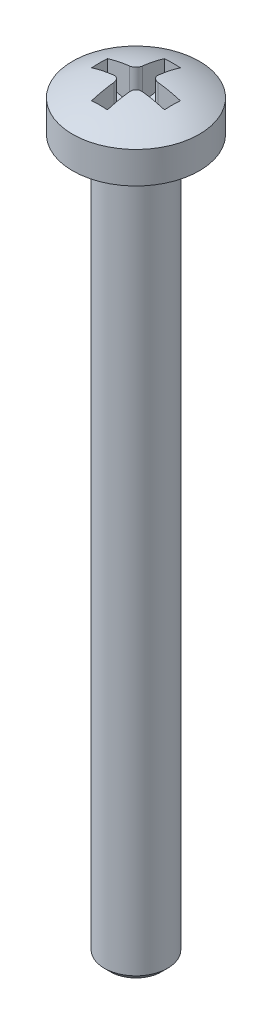
ISO-10303-21;
HEADER;
FILE_DESCRIPTION(('STEP AP214'),'2;1');
FILE_NAME('part.step','',(''),(''),'','','');
FILE_SCHEMA(('AUTOMOTIVE_DESIGN { 1 0 10303 214 1 1 1 1 }'));
ENDSEC;
DATA;
#1=APPLICATION_CONTEXT('core data for automotive mechanical design processes');
#2=APPLICATION_PROTOCOL_DEFINITION('international standard','automotive_design',2000,#1);
#3=PRODUCT_CONTEXT('',#1,'mechanical');
#4=PRODUCT('Part','Part','',(#3));
#5=PRODUCT_RELATED_PRODUCT_CATEGORY('part','',(#4));
#6=PRODUCT_DEFINITION_FORMATION('','',#4);
#7=PRODUCT_DEFINITION_CONTEXT('part definition',#1,'design');
#8=PRODUCT_DEFINITION('design','',#6,#7);
#9=PRODUCT_DEFINITION_SHAPE('','',#8);
#10=(LENGTH_UNIT() NAMED_UNIT(*) SI_UNIT(.MILLI.,.METRE.));
#11=(NAMED_UNIT(*) PLANE_ANGLE_UNIT() SI_UNIT($,.RADIAN.));
#12=(NAMED_UNIT(*) SI_UNIT($,.STERADIAN.) SOLID_ANGLE_UNIT());
#13=UNCERTAINTY_MEASURE_WITH_UNIT(LENGTH_MEASURE(1.E-05),#10,'distance_accuracy_value','');
#14=(GEOMETRIC_REPRESENTATION_CONTEXT(3) GLOBAL_UNCERTAINTY_ASSIGNED_CONTEXT((#13)) GLOBAL_UNIT_ASSIGNED_CONTEXT((#10,
#11,#12)) REPRESENTATION_CONTEXT('',''));
#15=CARTESIAN_POINT('',(0.,0.,0.));
#16=DIRECTION('',(0.,0.,1.));
#17=DIRECTION('',(1.,0.,0.));
#18=AXIS2_PLACEMENT_3D('',#15,#16,#17);
#19=CARTESIAN_POINT('',(2.00000000000001,-45.,0.));
#20=DIRECTION('',(0.,1.,0.));
#21=DIRECTION('',(0.,0.,1.));
#22=AXIS2_PLACEMENT_3D('',#19,#20,#21);
#23=PLANE('',#22);
#24=CARTESIAN_POINT('',(0.,-45.,0.));
#25=DIRECTION('',(0.,1.,0.));
#26=DIRECTION('',(0.,0.,1.));
#27=AXIS2_PLACEMENT_3D('',#24,#25,#26);
#28=CIRCLE('',#27,1.6);
#29=CARTESIAN_POINT('',(0.,-45.,1.6));
#30=VERTEX_POINT('',#29);
#31=EDGE_CURVE('E11',#30,#30,#28,.F.);
#32=ORIENTED_EDGE('',*,*,#31,.T.);
#33=EDGE_LOOP('',(#32));
#34=FACE_BOUND('',#33,.T.);
#35=ADVANCED_FACE('F37',(#34),#23,.F.);
#36=CARTESIAN_POINT('',(0.,-4.72272727272728,0.));
#37=DIRECTION('',(0.,1.,0.));
#38=DIRECTION('',(1.,0.,0.));
#39=AXIS2_PLACEMENT_3D('',#36,#37,#38);
#40=SPHERICAL_SURFACE('',#39,7.82272727272728);
#41=CARTESIAN_POINT('',(0.5,-4.72272727272728,0.));
#42=DIRECTION('',(1.,0.,0.));
#43=DIRECTION('',(0.,0.,-1.));
#44=AXIS2_PLACEMENT_3D('',#41,#42,#43);
#45=CIRCLE('',#44,7.80673183755348);
#46=CARTESIAN_POINT('',(0.5,2.73750476008987,-2.3));
#47=VERTEX_POINT('',#46);
#48=CARTESIAN_POINT('',(0.5,3.03195273249996,-0.9));
#49=VERTEX_POINT('',#48);
#50=EDGE_CURVE('E195',#47,#49,#45,.T.);
#51=ORIENTED_EDGE('',*,*,#50,.T.);
#52=CARTESIAN_POINT('',(0.5,3.03195273249996,-0.9));
#53=CARTESIAN_POINT('',(0.499980445653111,3.03454133641409,-0.877715199489853));
#54=CARTESIAN_POINT('',(0.501861325410847,3.0369109081898,-0.855406290685576));
#55=CARTESIAN_POINT('',(0.509308944557218,3.04115309750786,-0.811373363194762));
#56=CARTESIAN_POINT('',(0.514874142284133,3.04302592244948,-0.789649103823202));
#57=CARTESIAN_POINT('',(0.529581237998282,3.04621922226135,-0.747382590966706));
#58=CARTESIAN_POINT('',(0.538725894104163,3.0475392695665,-0.726841263013532));
#59=CARTESIAN_POINT('',(0.560335395409864,3.04958563422558,-0.687561895208892));
#60=CARTESIAN_POINT('',(0.572799188800053,3.05031213937239,-0.668823286645484));
#61=CARTESIAN_POINT('',(0.600596407799792,3.05114682561896,-0.633816736919395));
#62=CARTESIAN_POINT('',(0.615908512897499,3.05125942358876,-0.617531968951503));
#63=CARTESIAN_POINT('',(0.649026593510928,3.0508747494218,-0.587736528915892));
#64=CARTESIAN_POINT('',(0.666832948845617,3.05037738431157,-0.57422628012003));
#65=CARTESIAN_POINT('',(0.704363578386314,3.04879030089852,-0.550401537052683));
#66=CARTESIAN_POINT('',(0.724081674108829,3.04770244181268,-0.540077170971166));
#67=CARTESIAN_POINT('',(0.764919862434989,3.04496752601447,-0.522847557382613));
#68=CARTESIAN_POINT('',(0.786039420133905,3.04332068167708,-0.515941013789886));
#69=CARTESIAN_POINT('',(0.822714805755103,3.04007942212771,-0.5072274099574));
#70=CARTESIAN_POINT('',(0.838074093965798,3.03861284502167,-0.504517057384848));
#71=CARTESIAN_POINT('',(0.868957976534767,3.0354499847468,-0.500903202638105));
#72=CARTESIAN_POINT('',(0.88448230264661,3.03375403356009,-0.499997118337815));
#73=CARTESIAN_POINT('',(0.9,3.03195273249996,-0.5));
#74=B_SPLINE_CURVE_WITH_KNOTS('',3,(#52,#53,#54,#55,#56,#57,#58,#59,#60,#61,#62,#63,#64,#65,#66,
#67,#68,#69,#70,#71,#72,#73),.UNSPECIFIED.,.F.,.F.,(4,2,2,2,2,2,2,2,2,2,4),(0.,
0.0672224170043276,0.134416723302517,0.201662907801201,0.26888780779591,0.335628401088124,
0.402379168562592,0.468920974876219,0.535437528240593,0.582332561709017,0.629160434341086),.UNSPECIFIED.);
#75=CARTESIAN_POINT('',(0.9,3.03195273249996,-0.5));
#76=VERTEX_POINT('',#75);
#77=EDGE_CURVE('E257',#49,#76,#74,.T.);
#78=ORIENTED_EDGE('',*,*,#77,.T.);
#79=CARTESIAN_POINT('',(0.,-4.72272727272728,-0.5));
#80=DIRECTION('',(0.,0.,-1.));
#81=DIRECTION('',(-1.,0.,0.));
#82=AXIS2_PLACEMENT_3D('',#79,#80,#81);
#83=CIRCLE('',#82,7.80673183755348);
#84=CARTESIAN_POINT('',(2.3,2.73750476008987,-0.5));
#85=VERTEX_POINT('',#84);
#86=EDGE_CURVE('E193',#76,#85,#83,.T.);
#87=ORIENTED_EDGE('',*,*,#86,.T.);
#88=CARTESIAN_POINT('',(2.3,-4.72272727272728,0.));
#89=DIRECTION('',(1.,0.,0.));
#90=DIRECTION('',(0.,0.,-1.));
#91=AXIS2_PLACEMENT_3D('',#88,#89,#90);
#92=CIRCLE('',#91,7.47696876972688);
#93=CARTESIAN_POINT('',(2.3,2.73750476008987,0.5));
#94=VERTEX_POINT('',#93);
#95=EDGE_CURVE('E170',#85,#94,#92,.T.);
#96=ORIENTED_EDGE('',*,*,#95,.T.);
#97=CARTESIAN_POINT('',(0.,-4.72272727272728,0.5));
#98=DIRECTION('',(0.,0.,1.));
#99=DIRECTION('',(1.,0.,0.));
#100=AXIS2_PLACEMENT_3D('',#97,#98,#99);
#101=CIRCLE('',#100,7.80673183755348);
#102=CARTESIAN_POINT('',(0.9,3.03195273249996,0.5));
#103=VERTEX_POINT('',#102);
#104=EDGE_CURVE('E219',#94,#103,#101,.T.);
#105=ORIENTED_EDGE('',*,*,#104,.T.);
#106=CARTESIAN_POINT('',(0.9,3.03195273249996,0.5));
#107=CARTESIAN_POINT('',(0.877715199489853,3.03454133641409,0.499980445653111));
#108=CARTESIAN_POINT('',(0.855406290685576,3.0369109081898,0.501861325410847));
#109=CARTESIAN_POINT('',(0.811373363194762,3.04115309750786,0.509308944557218));
#110=CARTESIAN_POINT('',(0.789649103823202,3.04302592244948,0.514874142284133));
#111=CARTESIAN_POINT('',(0.747382590966706,3.04621922226135,0.529581237998282));
#112=CARTESIAN_POINT('',(0.726841263013532,3.0475392695665,0.538725894104163));
#113=CARTESIAN_POINT('',(0.687561895208891,3.04958563422558,0.560335395409864));
#114=CARTESIAN_POINT('',(0.668823286645484,3.05031213937239,0.572799188800053));
#115=CARTESIAN_POINT('',(0.633816736919395,3.05114682561896,0.600596407799792));
#116=CARTESIAN_POINT('',(0.617531968951503,3.05125942358877,0.6159085128975));
#117=CARTESIAN_POINT('',(0.587736528915892,3.0508747494218,0.649026593510929));
#118=CARTESIAN_POINT('',(0.57422628012003,3.05037738431157,0.666832948845617));
#119=CARTESIAN_POINT('',(0.550401537052683,3.04879030089852,0.704363578386314));
#120=CARTESIAN_POINT('',(0.540077170971166,3.04770244181268,0.724081674108829));
#121=CARTESIAN_POINT('',(0.522847557382613,3.04496752601447,0.764919862434989));
#122=CARTESIAN_POINT('',(0.515941013789886,3.04332068167708,0.786039420133905));
#123=CARTESIAN_POINT('',(0.5072274099574,3.04007942212771,0.822714805755103));
#124=CARTESIAN_POINT('',(0.504517057384848,3.03861284502167,0.838074093965798));
#125=CARTESIAN_POINT('',(0.500903202638105,3.03544998474679,0.868957976534767));
#126=CARTESIAN_POINT('',(0.499997118337815,3.03375403356009,0.884482302646609));
#127=CARTESIAN_POINT('',(0.5,3.03195273249996,0.9));
#128=B_SPLINE_CURVE_WITH_KNOTS('',3,(#106,#107,#108,#109,#110,#111,#112,#113,#114,#115,#116,
#117,#118,#119,#120,#121,#122,#123,#124,#125,#126,#127),.UNSPECIFIED.,.F.,.F.,(4,2,2,2,2,2,2,2,
2,2,4),(0.,0.0672224170043276,0.134416723302517,0.201662907801201,0.268887807795911,
0.335628401088124,0.402379168562592,0.468920974876219,0.535437528240593,0.582332561709017,
0.629160434341086),.UNSPECIFIED.);
#129=CARTESIAN_POINT('',(0.5,3.03195273249996,0.9));
#130=VERTEX_POINT('',#129);
#131=EDGE_CURVE('E252',#103,#130,#128,.T.);
#132=ORIENTED_EDGE('',*,*,#131,.T.);
#133=CARTESIAN_POINT('',(0.5,-4.72272727272728,0.));
#134=DIRECTION('',(1.,0.,0.));
#135=DIRECTION('',(0.,0.,-1.));
#136=AXIS2_PLACEMENT_3D('',#133,#134,#135);
#137=CIRCLE('',#136,7.80673183755348);
#138=CARTESIAN_POINT('',(0.5,2.73750476008987,2.3));
#139=VERTEX_POINT('',#138);
#140=EDGE_CURVE('E217',#130,#139,#137,.T.);
#141=ORIENTED_EDGE('',*,*,#140,.T.);
#142=CARTESIAN_POINT('',(0.,-4.72272727272728,2.3));
#143=DIRECTION('',(0.,0.,1.));
#144=DIRECTION('',(1.,0.,0.));
#145=AXIS2_PLACEMENT_3D('',#142,#143,#144);
#146=CIRCLE('',#145,7.47696876972688);
#147=CARTESIAN_POINT('',(-0.5,2.73750476008987,2.3));
#148=VERTEX_POINT('',#147);
#149=EDGE_CURVE('E214',#139,#148,#146,.T.);
#150=ORIENTED_EDGE('',*,*,#149,.T.);
#151=CARTESIAN_POINT('',(-0.5,-4.72272727272728,0.));
#152=DIRECTION('',(-1.,0.,0.));
#153=DIRECTION('',(0.,0.,1.));
#154=AXIS2_PLACEMENT_3D('',#151,#152,#153);
#155=CIRCLE('',#154,7.80673183755348);
#156=CARTESIAN_POINT('',(-0.5,3.03195273249996,0.9));
#157=VERTEX_POINT('',#156);
#158=EDGE_CURVE('E211',#148,#157,#155,.T.);
#159=ORIENTED_EDGE('',*,*,#158,.T.);
#160=CARTESIAN_POINT('',(-0.5,3.03195273249996,0.9));
#161=CARTESIAN_POINT('',(-0.499980445653111,3.03454133641409,0.877715199489853));
#162=CARTESIAN_POINT('',(-0.501861325410847,3.0369109081898,0.855406290685576));
#163=CARTESIAN_POINT('',(-0.509308944557218,3.04115309750786,0.811373363194762));
#164=CARTESIAN_POINT('',(-0.514874142284133,3.04302592244948,0.789649103823202));
#165=CARTESIAN_POINT('',(-0.529581237998282,3.04621922226135,0.747382590966706));
#166=CARTESIAN_POINT('',(-0.538725894104163,3.0475392695665,0.726841263013532));
#167=CARTESIAN_POINT('',(-0.560335395409864,3.04958563422558,0.687561895208892));
#168=CARTESIAN_POINT('',(-0.572799188800053,3.05031213937239,0.668823286645484));
#169=CARTESIAN_POINT('',(-0.600596407799792,3.05114682561896,0.633816736919395));
#170=CARTESIAN_POINT('',(-0.6159085128975,3.05125942358876,0.617531968951503));
#171=CARTESIAN_POINT('',(-0.649026593510929,3.0508747494218,0.587736528915892));
#172=CARTESIAN_POINT('',(-0.666832948845617,3.05037738431157,0.57422628012003));
#173=CARTESIAN_POINT('',(-0.704363578386314,3.04879030089852,0.550401537052683));
#174=CARTESIAN_POINT('',(-0.724081674108829,3.04770244181268,0.540077170971166));
#175=CARTESIAN_POINT('',(-0.764919862434989,3.04496752601447,0.522847557382613));
#176=CARTESIAN_POINT('',(-0.786039420133905,3.04332068167708,0.515941013789887));
#177=CARTESIAN_POINT('',(-0.822714805755103,3.04007942212771,0.5072274099574));
#178=CARTESIAN_POINT('',(-0.838074093965798,3.03861284502167,0.504517057384848));
#179=CARTESIAN_POINT('',(-0.868957976534767,3.0354499847468,0.500903202638105));
#180=CARTESIAN_POINT('',(-0.88448230264661,3.03375403356009,0.499997118337815));
#181=CARTESIAN_POINT('',(-0.9,3.03195273249996,0.5));
#182=B_SPLINE_CURVE_WITH_KNOTS('',3,(#160,#161,#162,#163,#164,#165,#166,#167,#168,#169,#170,
#171,#172,#173,#174,#175,#176,#177,#178,#179,#180,#181),.UNSPECIFIED.,.F.,.F.,(4,2,2,2,2,2,2,2,
2,2,4),(0.,0.0672224170043276,0.134416723302517,0.201662907801201,0.26888780779591,
0.335628401088124,0.402379168562592,0.468920974876219,0.535437528240592,0.582332561709017,
0.629160434341086),.UNSPECIFIED.);
#183=CARTESIAN_POINT('',(-0.9,3.03195273249996,0.5));
#184=VERTEX_POINT('',#183);
#185=EDGE_CURVE('E231',#157,#184,#182,.T.);
#186=ORIENTED_EDGE('',*,*,#185,.T.);
#187=CARTESIAN_POINT('',(0.,-4.72272727272728,0.5));
#188=DIRECTION('',(0.,0.,1.));
#189=DIRECTION('',(1.,0.,0.));
#190=AXIS2_PLACEMENT_3D('',#187,#188,#189);
#191=CIRCLE('',#190,7.80673183755348);
#192=CARTESIAN_POINT('',(-2.3,2.73750476008987,0.5));
#193=VERTEX_POINT('',#192);
#194=EDGE_CURVE('E209',#184,#193,#191,.T.);
#195=ORIENTED_EDGE('',*,*,#194,.T.);
#196=CARTESIAN_POINT('',(-2.3,-4.72272727272728,0.));
#197=DIRECTION('',(-1.,0.,0.));
#198=DIRECTION('',(0.,0.,1.));
#199=AXIS2_PLACEMENT_3D('',#196,#197,#198);
#200=CIRCLE('',#199,7.47696876972688);
#201=CARTESIAN_POINT('',(-2.3,2.73750476008987,-0.5));
#202=VERTEX_POINT('',#201);
#203=EDGE_CURVE('E206',#193,#202,#200,.T.);
#204=ORIENTED_EDGE('',*,*,#203,.T.);
#205=CARTESIAN_POINT('',(0.,-4.72272727272728,-0.5));
#206=DIRECTION('',(0.,0.,-1.));
#207=DIRECTION('',(-1.,0.,0.));
#208=AXIS2_PLACEMENT_3D('',#205,#206,#207);
#209=CIRCLE('',#208,7.80673183755348);
#210=CARTESIAN_POINT('',(-0.9,3.03195273249996,-0.5));
#211=VERTEX_POINT('',#210);
#212=EDGE_CURVE('E203',#202,#211,#209,.T.);
#213=ORIENTED_EDGE('',*,*,#212,.T.);
#214=CARTESIAN_POINT('',(-0.9,3.03195273249996,-0.5));
#215=CARTESIAN_POINT('',(-0.877715199489853,3.03454133641409,-0.499980445653111));
#216=CARTESIAN_POINT('',(-0.855406290685576,3.0369109081898,-0.501861325410847));
#217=CARTESIAN_POINT('',(-0.811373363194762,3.04115309750786,-0.509308944557218));
#218=CARTESIAN_POINT('',(-0.789649103823202,3.04302592244948,-0.514874142284133));
#219=CARTESIAN_POINT('',(-0.747382590966706,3.04621922226135,-0.529581237998282));
#220=CARTESIAN_POINT('',(-0.726841263013532,3.0475392695665,-0.538725894104163));
#221=CARTESIAN_POINT('',(-0.687561895208892,3.04958563422558,-0.560335395409864));
#222=CARTESIAN_POINT('',(-0.668823286645484,3.05031213937239,-0.572799188800053));
#223=CARTESIAN_POINT('',(-0.633816736919395,3.05114682561896,-0.600596407799792));
#224=CARTESIAN_POINT('',(-0.617531968951503,3.05125942358877,-0.6159085128975));
#225=CARTESIAN_POINT('',(-0.587736528915892,3.0508747494218,-0.649026593510929));
#226=CARTESIAN_POINT('',(-0.57422628012003,3.05037738431157,-0.666832948845617));
#227=CARTESIAN_POINT('',(-0.550401537052683,3.04879030089852,-0.704363578386314));
#228=CARTESIAN_POINT('',(-0.540077170971166,3.04770244181268,-0.724081674108829));
#229=CARTESIAN_POINT('',(-0.522847557382613,3.04496752601447,-0.764919862434989));
#230=CARTESIAN_POINT('',(-0.515941013789887,3.04332068167708,-0.786039420133905));
#231=CARTESIAN_POINT('',(-0.5072274099574,3.04007942212771,-0.822714805755103));
#232=CARTESIAN_POINT('',(-0.504517057384848,3.03861284502167,-0.838074093965798));
#233=CARTESIAN_POINT('',(-0.500903202638105,3.03544998474679,-0.868957976534767));
#234=CARTESIAN_POINT('',(-0.499997118337815,3.03375403356009,-0.88448230264661));
#235=CARTESIAN_POINT('',(-0.5,3.03195273249996,-0.9));
#236=B_SPLINE_CURVE_WITH_KNOTS('',3,(#214,#215,#216,#217,#218,#219,#220,#221,#222,#223,#224,
#225,#226,#227,#228,#229,#230,#231,#232,#233,#234,#235),.UNSPECIFIED.,.F.,.F.,(4,2,2,2,2,2,2,2,
2,2,4),(0.,0.0672224170043276,0.134416723302517,0.201662907801201,0.268887807795911,
0.335628401088124,0.402379168562592,0.468920974876219,0.535437528240593,0.582332561709018,
0.629160434341086),.UNSPECIFIED.);
#237=CARTESIAN_POINT('',(-0.5,3.03195273249996,-0.9));
#238=VERTEX_POINT('',#237);
#239=EDGE_CURVE('E225',#211,#238,#236,.T.);
#240=ORIENTED_EDGE('',*,*,#239,.T.);
#241=CARTESIAN_POINT('',(-0.5,-4.72272727272728,0.));
#242=DIRECTION('',(-1.,0.,0.));
#243=DIRECTION('',(0.,0.,1.));
#244=AXIS2_PLACEMENT_3D('',#241,#242,#243);
#245=CIRCLE('',#244,7.80673183755348);
#246=CARTESIAN_POINT('',(-0.5,2.73750476008987,-2.3));
#247=VERTEX_POINT('',#246);
#248=EDGE_CURVE('E201',#238,#247,#245,.T.);
#249=ORIENTED_EDGE('',*,*,#248,.T.);
#250=CARTESIAN_POINT('',(0.,-4.72272727272728,-2.3));
#251=DIRECTION('',(0.,0.,-1.));
#252=DIRECTION('',(-1.,0.,0.));
#253=AXIS2_PLACEMENT_3D('',#250,#251,#252);
#254=CIRCLE('',#253,7.47696876972688);
#255=EDGE_CURVE('E198',#247,#47,#254,.T.);
#256=ORIENTED_EDGE('',*,*,#255,.T.);
#257=EDGE_LOOP('',(#51,#78,#87,#96,#105,#132,#141,#150,#159,#186,#195,#204,#213,#240,#249,#256));
#258=FACE_BOUND('',#257,.T.);
#259=CARTESIAN_POINT('',(0.,2.,0.));
#260=DIRECTION('',(0.,1.,0.));
#261=DIRECTION('',(0.,0.,1.));
#262=AXIS2_PLACEMENT_3D('',#259,#260,#261);
#263=CIRCLE('',#262,4.);
#264=CARTESIAN_POINT('',(0.,2.,4.));
#265=VERTEX_POINT('',#264);
#266=EDGE_CURVE('E189',#265,#265,#263,.T.);
#267=ORIENTED_EDGE('',*,*,#266,.T.);
#268=EDGE_LOOP('',(#267));
#269=FACE_BOUND('',#268,.T.);
#270=ADVANCED_FACE('F239',(#258,#269),#40,.T.);
#271=CARTESIAN_POINT('',(0.,3.1,0.));
#272=DIRECTION('',(0.,1.,0.));
#273=DIRECTION('',(0.,0.,1.));
#274=AXIS2_PLACEMENT_3D('',#271,#272,#273);
#275=CYLINDRICAL_SURFACE('',#274,4.);
#276=ORIENTED_EDGE('',*,*,#266,.F.);
#277=EDGE_LOOP('',(#276));
#278=FACE_BOUND('',#277,.T.);
#279=CARTESIAN_POINT('',(0.,0.,0.));
#280=DIRECTION('',(0.,1.,0.));
#281=DIRECTION('',(0.,0.,1.));
#282=AXIS2_PLACEMENT_3D('',#279,#280,#281);
#283=CIRCLE('',#282,4.);
#284=CARTESIAN_POINT('',(0.,0.,4.));
#285=VERTEX_POINT('',#284);
#286=EDGE_CURVE('E181',#285,#285,#283,.T.);
#287=ORIENTED_EDGE('',*,*,#286,.T.);
#288=EDGE_LOOP('',(#287));
#289=FACE_BOUND('',#288,.T.);
#290=ADVANCED_FACE('F244',(#278,#289),#275,.T.);
#291=CARTESIAN_POINT('',(4.,0.,0.));
#292=DIRECTION('',(0.,1.,0.));
#293=DIRECTION('',(0.,0.,1.));
#294=AXIS2_PLACEMENT_3D('',#291,#292,#293);
#295=PLANE('',#294);
#296=ORIENTED_EDGE('',*,*,#286,.F.);
#297=EDGE_LOOP('',(#296));
#298=FACE_BOUND('',#297,.T.);
#299=CARTESIAN_POINT('',(0.,0.,0.));
#300=DIRECTION('',(0.,1.,0.));
#301=DIRECTION('',(0.,0.,1.));
#302=AXIS2_PLACEMENT_3D('',#299,#300,#301);
#303=CIRCLE('',#302,2.);
#304=CARTESIAN_POINT('',(0.,0.,2.));
#305=VERTEX_POINT('',#304);
#306=EDGE_CURVE('E178',#305,#305,#303,.T.);
#307=ORIENTED_EDGE('',*,*,#306,.T.);
#308=EDGE_LOOP('',(#307));
#309=FACE_BOUND('',#308,.T.);
#310=ADVANCED_FACE('F331',(#298,#309),#295,.F.);
#311=CARTESIAN_POINT('',(0.,3.1,0.));
#312=DIRECTION('',(0.,1.,0.));
#313=DIRECTION('',(0.,0.,1.));
#314=AXIS2_PLACEMENT_3D('',#311,#312,#313);
#315=CYLINDRICAL_SURFACE('',#314,2.);
#316=CARTESIAN_POINT('',(0.,-44.6,0.));
#317=DIRECTION('',(0.,1.,0.));
#318=DIRECTION('',(0.,0.,1.));
#319=AXIS2_PLACEMENT_3D('',#316,#317,#318);
#320=CIRCLE('',#319,2.);
#321=CARTESIAN_POINT('',(0.,-44.6,2.));
#322=VERTEX_POINT('',#321);
#323=EDGE_CURVE('E45',#322,#322,#320,.T.);
#324=ORIENTED_EDGE('',*,*,#323,.T.);
#325=EDGE_LOOP('',(#324));
#326=FACE_BOUND('',#325,.T.);
#327=ORIENTED_EDGE('',*,*,#306,.F.);
#328=EDGE_LOOP('',(#327));
#329=FACE_BOUND('',#328,.T.);
#330=ADVANCED_FACE('F303',(#326,#329),#315,.T.);
#331=CARTESIAN_POINT('',(0.5,-45.001,0.5));
#332=DIRECTION('',(0.,0.,1.));
#333=DIRECTION('',(1.,0.,0.));
#334=AXIS2_PLACEMENT_3D('',#331,#332,#333);
#335=PLANE('',#334);
#336=CARTESIAN_POINT('',(0.,9.49999999999998,0.5));
#337=DIRECTION('',(0.,0.,1.));
#338=DIRECTION('',(1.,0.,0.));
#339=AXIS2_PLACEMENT_3D('',#336,#337,#338);
#340=CIRCLE('',#339,8.48528137423855);
#341=CARTESIAN_POINT('',(2.3,1.3323810079069,0.5));
#342=VERTEX_POINT('',#341);
#343=CARTESIAN_POINT('',(0.9,1.06258333374486,0.5));
#344=VERTEX_POINT('',#343);
#345=EDGE_CURVE('E176',#342,#344,#340,.F.);
#346=ORIENTED_EDGE('',*,*,#345,.T.);
#347=DIRECTION('',(0.,1.,0.));
#348=VECTOR('',#347,1.);
#349=CARTESIAN_POINT('',(0.9,-45.001,0.5));
#350=LINE('',#349,#348);
#351=EDGE_CURVE('E556',#344,#103,#350,.T.);
#352=ORIENTED_EDGE('',*,*,#351,.T.);
#353=ORIENTED_EDGE('',*,*,#104,.F.);
#354=DIRECTION('',(0.,1.,0.));
#355=VECTOR('',#354,1.);
#356=CARTESIAN_POINT('',(2.3,-45.001,0.5));
#357=LINE('',#356,#355);
#358=EDGE_CURVE('E172',#342,#94,#357,.T.);
#359=ORIENTED_EDGE('',*,*,#358,.F.);
#360=EDGE_LOOP('',(#346,#352,#353,#359));
#361=FACE_BOUND('',#360,.T.);
#362=ADVANCED_FACE('F344',(#361),#335,.F.);
#363=CARTESIAN_POINT('',(0.5,-45.001,0.5));
#364=DIRECTION('',(1.,0.,0.));
#365=DIRECTION('',(0.,0.,-1.));
#366=AXIS2_PLACEMENT_3D('',#363,#364,#365);
#367=PLANE('',#366);
#368=ORIENTED_EDGE('',*,*,#140,.F.);
#369=DIRECTION('',(0.,1.,0.));
#370=VECTOR('',#369,1.);
#371=CARTESIAN_POINT('',(0.5,-45.001,0.9));
#372=LINE('',#371,#370);
#373=CARTESIAN_POINT('',(0.5,1.06258333374486,0.9));
#374=VERTEX_POINT('',#373);
#375=EDGE_CURVE('E554',#130,#374,#372,.F.);
#376=ORIENTED_EDGE('',*,*,#375,.T.);
#377=CARTESIAN_POINT('',(0.5,9.49999999999998,0.));
#378=DIRECTION('',(1.,0.,0.));
#379=DIRECTION('',(0.,0.,-1.));
#380=AXIS2_PLACEMENT_3D('',#377,#378,#379);
#381=CIRCLE('',#380,8.48528137423855);
#382=CARTESIAN_POINT('',(0.5,1.3323810079069,2.3));
#383=VERTEX_POINT('',#382);
#384=EDGE_CURVE('E183',#374,#383,#381,.F.);
#385=ORIENTED_EDGE('',*,*,#384,.T.);
#386=DIRECTION('',(0.,1.,0.));
#387=VECTOR('',#386,1.);
#388=CARTESIAN_POINT('',(0.5,-45.001,2.3));
#389=LINE('',#388,#387);
#390=EDGE_CURVE('E162',#383,#139,#389,.T.);
#391=ORIENTED_EDGE('',*,*,#390,.T.);
#392=EDGE_LOOP('',(#368,#376,#385,#391));
#393=FACE_BOUND('',#392,.T.);
#394=ADVANCED_FACE('F292',(#393),#367,.F.);
#395=CARTESIAN_POINT('',(-0.5,-45.001,2.3));
#396=DIRECTION('',(0.,0.,1.));
#397=DIRECTION('',(1.,0.,0.));
#398=AXIS2_PLACEMENT_3D('',#395,#396,#397);
#399=PLANE('',#398);
#400=ORIENTED_EDGE('',*,*,#390,.F.);
#401=CARTESIAN_POINT('',(0.,9.49999999999998,2.3));
#402=DIRECTION('',(0.,0.,1.));
#403=DIRECTION('',(1.,0.,0.));
#404=AXIS2_PLACEMENT_3D('',#401,#402,#403);
#405=CIRCLE('',#404,8.18290901819149);
#406=CARTESIAN_POINT('',(-0.5,1.3323810079069,2.3));
#407=VERTEX_POINT('',#406);
#408=EDGE_CURVE('E518',#383,#407,#405,.F.);
#409=ORIENTED_EDGE('',*,*,#408,.T.);
#410=DIRECTION('',(0.,1.,0.));
#411=VECTOR('',#410,1.);
#412=CARTESIAN_POINT('',(-0.5,-45.001,2.3));
#413=LINE('',#412,#411);
#414=EDGE_CURVE('E517',#407,#148,#413,.T.);
#415=ORIENTED_EDGE('',*,*,#414,.T.);
#416=ORIENTED_EDGE('',*,*,#149,.F.);
#417=EDGE_LOOP('',(#400,#409,#415,#416));
#418=FACE_BOUND('',#417,.T.);
#419=ADVANCED_FACE('F357',(#418),#399,.F.);
#420=CARTESIAN_POINT('',(-0.5,-45.001,0.5));
#421=DIRECTION('',(-1.,0.,0.));
#422=DIRECTION('',(0.,0.,1.));
#423=AXIS2_PLACEMENT_3D('',#420,#421,#422);
#424=PLANE('',#423);
#425=CARTESIAN_POINT('',(-0.5,9.49999999999998,0.));
#426=DIRECTION('',(-1.,0.,0.));
#427=DIRECTION('',(0.,0.,1.));
#428=AXIS2_PLACEMENT_3D('',#425,#426,#427);
#429=CIRCLE('',#428,8.48528137423855);
#430=CARTESIAN_POINT('',(-0.5,1.06258333374486,0.9));
#431=VERTEX_POINT('',#430);
#432=EDGE_CURVE('E512',#407,#431,#429,.F.);
#433=ORIENTED_EDGE('',*,*,#432,.T.);
#434=DIRECTION('',(0.,1.,0.));
#435=VECTOR('',#434,1.);
#436=CARTESIAN_POINT('',(-0.5,-45.001,0.9));
#437=LINE('',#436,#435);
#438=EDGE_CURVE('E507',#431,#157,#437,.T.);
#439=ORIENTED_EDGE('',*,*,#438,.T.);
#440=ORIENTED_EDGE('',*,*,#158,.F.);
#441=ORIENTED_EDGE('',*,*,#414,.F.);
#442=EDGE_LOOP('',(#433,#439,#440,#441));
#443=FACE_BOUND('',#442,.T.);
#444=ADVANCED_FACE('F364',(#443),#424,.F.);
#445=CARTESIAN_POINT('',(-2.3,-45.001,0.5));
#446=DIRECTION('',(0.,0.,1.));
#447=DIRECTION('',(1.,0.,0.));
#448=AXIS2_PLACEMENT_3D('',#445,#446,#447);
#449=PLANE('',#448);
#450=ORIENTED_EDGE('',*,*,#194,.F.);
#451=DIRECTION('',(0.,1.,0.));
#452=VECTOR('',#451,1.);
#453=CARTESIAN_POINT('',(-0.9,-45.001,0.5));
#454=LINE('',#453,#452);
#455=CARTESIAN_POINT('',(-0.9,1.06258333374486,0.5));
#456=VERTEX_POINT('',#455);
#457=EDGE_CURVE('E505',#184,#456,#454,.F.);
#458=ORIENTED_EDGE('',*,*,#457,.T.);
#459=CARTESIAN_POINT('',(0.,9.49999999999998,0.5));
#460=DIRECTION('',(0.,0.,1.));
#461=DIRECTION('',(1.,0.,0.));
#462=AXIS2_PLACEMENT_3D('',#459,#460,#461);
#463=CIRCLE('',#462,8.48528137423855);
#464=CARTESIAN_POINT('',(-2.3,1.3323810079069,0.5));
#465=VERTEX_POINT('',#464);
#466=EDGE_CURVE('E515',#456,#465,#463,.F.);
#467=ORIENTED_EDGE('',*,*,#466,.T.);
#468=DIRECTION('',(0.,1.,0.));
#469=VECTOR('',#468,1.);
#470=CARTESIAN_POINT('',(-2.3,-45.001,0.5));
#471=LINE('',#470,#469);
#472=EDGE_CURVE('E529',#465,#193,#471,.T.);
#473=ORIENTED_EDGE('',*,*,#472,.T.);
#474=EDGE_LOOP('',(#450,#458,#467,#473));
#475=FACE_BOUND('',#474,.T.);
#476=ADVANCED_FACE('F371',(#475),#449,.F.);
#477=CARTESIAN_POINT('',(-2.3,-45.001,-0.5));
#478=DIRECTION('',(-1.,0.,0.));
#479=DIRECTION('',(0.,0.,1.));
#480=AXIS2_PLACEMENT_3D('',#477,#478,#479);
#481=PLANE('',#480);
#482=ORIENTED_EDGE('',*,*,#472,.F.);
#483=CARTESIAN_POINT('',(-2.3,9.49999999999998,0.));
#484=DIRECTION('',(-1.,0.,0.));
#485=DIRECTION('',(0.,0.,1.));
#486=AXIS2_PLACEMENT_3D('',#483,#484,#485);
#487=CIRCLE('',#486,8.18290901819149);
#488=CARTESIAN_POINT('',(-2.3,1.3323810079069,-0.5));
#489=VERTEX_POINT('',#488);
#490=EDGE_CURVE('E521',#465,#489,#487,.F.);
#491=ORIENTED_EDGE('',*,*,#490,.T.);
#492=DIRECTION('',(0.,1.,0.));
#493=VECTOR('',#492,1.);
#494=CARTESIAN_POINT('',(-2.3,-45.001,-0.5));
#495=LINE('',#494,#493);
#496=EDGE_CURVE('E532',#489,#202,#495,.T.);
#497=ORIENTED_EDGE('',*,*,#496,.T.);
#498=ORIENTED_EDGE('',*,*,#203,.F.);
#499=EDGE_LOOP('',(#482,#491,#497,#498));
#500=FACE_BOUND('',#499,.T.);
#501=ADVANCED_FACE('F379',(#500),#481,.F.);
#502=CARTESIAN_POINT('',(-2.3,-45.001,-0.5));
#503=DIRECTION('',(0.,0.,-1.));
#504=DIRECTION('',(-1.,0.,0.));
#505=AXIS2_PLACEMENT_3D('',#502,#503,#504);
#506=PLANE('',#505);
#507=CARTESIAN_POINT('',(0.,9.49999999999998,-0.5));
#508=DIRECTION('',(0.,0.,-1.));
#509=DIRECTION('',(-1.,0.,0.));
#510=AXIS2_PLACEMENT_3D('',#507,#508,#509);
#511=CIRCLE('',#510,8.48528137423855);
#512=CARTESIAN_POINT('',(-0.9,1.06258333374486,-0.5));
#513=VERTEX_POINT('',#512);
#514=EDGE_CURVE('E564',#489,#513,#511,.F.);
#515=ORIENTED_EDGE('',*,*,#514,.T.);
#516=DIRECTION('',(0.,1.,0.));
#517=VECTOR('',#516,1.);
#518=CARTESIAN_POINT('',(-0.9,-45.001,-0.5));
#519=LINE('',#518,#517);
#520=EDGE_CURVE('E549',#513,#211,#519,.T.);
#521=ORIENTED_EDGE('',*,*,#520,.T.);
#522=ORIENTED_EDGE('',*,*,#212,.F.);
#523=ORIENTED_EDGE('',*,*,#496,.F.);
#524=EDGE_LOOP('',(#515,#521,#522,#523));
#525=FACE_BOUND('',#524,.T.);
#526=ADVANCED_FACE('F387',(#525),#506,.F.);
#527=CARTESIAN_POINT('',(-0.5,-45.001,-2.3));
#528=DIRECTION('',(-1.,0.,0.));
#529=DIRECTION('',(0.,0.,1.));
#530=AXIS2_PLACEMENT_3D('',#527,#528,#529);
#531=PLANE('',#530);
#532=ORIENTED_EDGE('',*,*,#248,.F.);
#533=DIRECTION('',(0.,1.,0.));
#534=VECTOR('',#533,1.);
#535=CARTESIAN_POINT('',(-0.5,-45.001,-0.9));
#536=LINE('',#535,#534);
#537=CARTESIAN_POINT('',(-0.5,1.06258333374486,-0.9));
#538=VERTEX_POINT('',#537);
#539=EDGE_CURVE('E52',#238,#538,#536,.F.);
#540=ORIENTED_EDGE('',*,*,#539,.T.);
#541=CARTESIAN_POINT('',(-0.5,9.49999999999998,0.));
#542=DIRECTION('',(-1.,0.,0.));
#543=DIRECTION('',(0.,0.,1.));
#544=AXIS2_PLACEMENT_3D('',#541,#542,#543);
#545=CIRCLE('',#544,8.48528137423855);
#546=CARTESIAN_POINT('',(-0.5,1.3323810079069,-2.3));
#547=VERTEX_POINT('',#546);
#548=EDGE_CURVE('E560',#538,#547,#545,.F.);
#549=ORIENTED_EDGE('',*,*,#548,.T.);
#550=DIRECTION('',(0.,1.,0.));
#551=VECTOR('',#550,1.);
#552=CARTESIAN_POINT('',(-0.5,-45.001,-2.3));
#553=LINE('',#552,#551);
#554=EDGE_CURVE('E535',#547,#247,#553,.T.);
#555=ORIENTED_EDGE('',*,*,#554,.T.);
#556=EDGE_LOOP('',(#532,#540,#549,#555));
#557=FACE_BOUND('',#556,.T.);
#558=ADVANCED_FACE('F395',(#557),#531,.F.);
#559=CARTESIAN_POINT('',(-0.5,-45.001,-2.3));
#560=DIRECTION('',(0.,0.,-1.));
#561=DIRECTION('',(-1.,0.,0.));
#562=AXIS2_PLACEMENT_3D('',#559,#560,#561);
#563=PLANE('',#562);
#564=ORIENTED_EDGE('',*,*,#554,.F.);
#565=CARTESIAN_POINT('',(0.,9.49999999999998,-2.3));
#566=DIRECTION('',(0.,0.,-1.));
#567=DIRECTION('',(-1.,0.,0.));
#568=AXIS2_PLACEMENT_3D('',#565,#566,#567);
#569=CIRCLE('',#568,8.18290901819149);
#570=CARTESIAN_POINT('',(0.5,1.3323810079069,-2.3));
#571=VERTEX_POINT('',#570);
#572=EDGE_CURVE('E543',#547,#571,#569,.F.);
#573=ORIENTED_EDGE('',*,*,#572,.T.);
#574=DIRECTION('',(0.,1.,0.));
#575=VECTOR('',#574,1.);
#576=CARTESIAN_POINT('',(0.5,-45.001,-2.3));
#577=LINE('',#576,#575);
#578=EDGE_CURVE('E171',#571,#47,#577,.T.);
#579=ORIENTED_EDGE('',*,*,#578,.T.);
#580=ORIENTED_EDGE('',*,*,#255,.F.);
#581=EDGE_LOOP('',(#564,#573,#579,#580));
#582=FACE_BOUND('',#581,.T.);
#583=ADVANCED_FACE('F403',(#582),#563,.F.);
#584=CARTESIAN_POINT('',(0.5,-45.001,-2.3));
#585=DIRECTION('',(1.,0.,0.));
#586=DIRECTION('',(0.,0.,-1.));
#587=AXIS2_PLACEMENT_3D('',#584,#585,#586);
#588=PLANE('',#587);
#589=CARTESIAN_POINT('',(0.5,9.49999999999998,0.));
#590=DIRECTION('',(1.,0.,0.));
#591=DIRECTION('',(0.,0.,-1.));
#592=AXIS2_PLACEMENT_3D('',#589,#590,#591);
#593=CIRCLE('',#592,8.48528137423855);
#594=CARTESIAN_POINT('',(0.5,1.06258333374486,-0.9));
#595=VERTEX_POINT('',#594);
#596=EDGE_CURVE('E161',#571,#595,#593,.F.);
#597=ORIENTED_EDGE('',*,*,#596,.T.);
#598=DIRECTION('',(0.,1.,0.));
#599=VECTOR('',#598,1.);
#600=CARTESIAN_POINT('',(0.5,-45.001,-0.9));
#601=LINE('',#600,#599);
#602=EDGE_CURVE('E222',#595,#49,#601,.T.);
#603=ORIENTED_EDGE('',*,*,#602,.T.);
#604=ORIENTED_EDGE('',*,*,#50,.F.);
#605=ORIENTED_EDGE('',*,*,#578,.F.);
#606=EDGE_LOOP('',(#597,#603,#604,#605));
#607=FACE_BOUND('',#606,.T.);
#608=ADVANCED_FACE('F410',(#607),#588,.F.);
#609=CARTESIAN_POINT('',(0.5,-45.001,-0.5));
#610=DIRECTION('',(0.,0.,-1.));
#611=DIRECTION('',(-1.,0.,0.));
#612=AXIS2_PLACEMENT_3D('',#609,#610,#611);
#613=PLANE('',#612);
#614=ORIENTED_EDGE('',*,*,#86,.F.);
#615=DIRECTION('',(0.,1.,0.));
#616=VECTOR('',#615,1.);
#617=CARTESIAN_POINT('',(0.9,-45.001,-0.5));
#618=LINE('',#617,#616);
#619=CARTESIAN_POINT('',(0.9,1.06258333374486,-0.5));
#620=VERTEX_POINT('',#619);
#621=EDGE_CURVE('E158',#76,#620,#618,.F.);
#622=ORIENTED_EDGE('',*,*,#621,.T.);
#623=CARTESIAN_POINT('',(0.,9.49999999999998,-0.5));
#624=DIRECTION('',(0.,0.,-1.));
#625=DIRECTION('',(-1.,0.,0.));
#626=AXIS2_PLACEMENT_3D('',#623,#624,#625);
#627=CIRCLE('',#626,8.48528137423855);
#628=CARTESIAN_POINT('',(2.3,1.3323810079069,-0.5));
#629=VERTEX_POINT('',#628);
#630=EDGE_CURVE('E152',#620,#629,#627,.F.);
#631=ORIENTED_EDGE('',*,*,#630,.T.);
#632=DIRECTION('',(0.,1.,0.));
#633=VECTOR('',#632,1.);
#634=CARTESIAN_POINT('',(2.3,-45.001,-0.5));
#635=LINE('',#634,#633);
#636=EDGE_CURVE('E156',#629,#85,#635,.T.);
#637=ORIENTED_EDGE('',*,*,#636,.T.);
#638=EDGE_LOOP('',(#614,#622,#631,#637));
#639=FACE_BOUND('',#638,.T.);
#640=ADVANCED_FACE('F155',(#639),#613,.F.);
#641=CARTESIAN_POINT('',(2.3,-45.001,-0.5));
#642=DIRECTION('',(1.,0.,0.));
#643=DIRECTION('',(0.,0.,-1.));
#644=AXIS2_PLACEMENT_3D('',#641,#642,#643);
#645=PLANE('',#644);
#646=ORIENTED_EDGE('',*,*,#636,.F.);
#647=CARTESIAN_POINT('',(2.3,9.49999999999998,0.));
#648=DIRECTION('',(1.,0.,0.));
#649=DIRECTION('',(0.,0.,-1.));
#650=AXIS2_PLACEMENT_3D('',#647,#648,#649);
#651=CIRCLE('',#650,8.18290901819149);
#652=EDGE_CURVE('E167',#629,#342,#651,.F.);
#653=ORIENTED_EDGE('',*,*,#652,.T.);
#654=ORIENTED_EDGE('',*,*,#358,.T.);
#655=ORIENTED_EDGE('',*,*,#95,.F.);
#656=EDGE_LOOP('',(#646,#653,#654,#655));
#657=FACE_BOUND('',#656,.T.);
#658=ADVANCED_FACE('F166',(#657),#645,.F.);
#659=CARTESIAN_POINT('',(0.,9.49999999999998,0.));
#660=DIRECTION('',(0.,1.,0.));
#661=DIRECTION('',(1.,0.,0.));
#662=AXIS2_PLACEMENT_3D('',#659,#660,#661);
#663=SPHERICAL_SURFACE('',#662,8.49999999999998);
#664=ORIENTED_EDGE('',*,*,#345,.F.);
#665=ORIENTED_EDGE('',*,*,#652,.F.);
#666=ORIENTED_EDGE('',*,*,#630,.F.);
#667=CARTESIAN_POINT('',(0.9,1.06258333374486,-0.5));
#668=CARTESIAN_POINT('',(0.877681895176581,1.06020064583187,-0.499980506377996));
#669=CARTESIAN_POINT('',(0.855344205727362,1.0580201488652,-0.501866869905914));
#670=CARTESIAN_POINT('',(0.811264196369215,1.05411756501269,-0.509332340473144));
#671=CARTESIAN_POINT('',(0.78952159882242,1.05239526097159,-0.514909693823375));
#672=CARTESIAN_POINT('',(0.747228556255667,1.04945966047884,-0.529643735623788));
#673=CARTESIAN_POINT('',(0.726678990033897,1.04824673524169,-0.538803025087882));
#674=CARTESIAN_POINT('',(0.687389852539137,1.04636746374655,-0.560442280349619));
#675=CARTESIAN_POINT('',(0.668649749482246,1.04570095646757,-0.572921266446781));
#676=CARTESIAN_POINT('',(0.633625729643449,1.04493649451643,-0.600763861630353));
#677=CARTESIAN_POINT('',(0.617327507926939,1.04483509156346,-0.616109383561911));
#678=CARTESIAN_POINT('',(0.587514637710959,1.04519463942213,-0.649299998886555));
#679=CARTESIAN_POINT('',(0.574000432084661,1.04565567962496,-0.667145489209941));
#680=CARTESIAN_POINT('',(0.55017165377276,1.04712438551599,-0.704769667803527));
#681=CARTESIAN_POINT('',(0.539848822620757,1.04813062146146,-0.724543189195622));
#682=CARTESIAN_POINT('',(0.522637980126425,1.05065941614313,-0.765498290560969));
#683=CARTESIAN_POINT('',(0.515748559609182,1.05218176262027,-0.78667928881133));
#684=CARTESIAN_POINT('',(0.507116958212197,1.05516459963325,-0.823303350164225));
#685=CARTESIAN_POINT('',(0.504448298653858,1.05650461680506,-0.838544928463922));
#686=CARTESIAN_POINT('',(0.500889732891837,1.05939256924764,-0.869192646434852));
#687=CARTESIAN_POINT('',(0.499997287547255,1.06094020433808,-0.884598519500552));
#688=CARTESIAN_POINT('',(0.5,1.06258333374486,-0.9));
#689=B_SPLINE_CURVE_WITH_KNOTS('',3,(#667,#668,#669,#670,#671,#672,#673,#674,#675,#676,#677,
#678,#679,#680,#681,#682,#683,#684,#685,#686,#687,#688),.UNSPECIFIED.,.F.,.F.,(4,2,2,2,2,2,2,2,
2,2,4),(0.,0.0672520458092346,0.134472161271656,0.201741179358209,0.268990367163335,
0.33582874565086,0.402677748396607,0.469352286257207,0.535999436300152,0.582495090258099,
0.628924229684279),.UNSPECIFIED.);
#690=EDGE_CURVE('E280',#620,#595,#689,.T.);
#691=ORIENTED_EDGE('',*,*,#690,.T.);
#692=ORIENTED_EDGE('',*,*,#596,.F.);
#693=ORIENTED_EDGE('',*,*,#572,.F.);
#694=ORIENTED_EDGE('',*,*,#548,.F.);
#695=CARTESIAN_POINT('',(-0.5,1.06258333374486,-0.9));
#696=CARTESIAN_POINT('',(-0.499980506377996,1.06020064583187,-0.877681895176581));
#697=CARTESIAN_POINT('',(-0.501866869905914,1.0580201488652,-0.855344205727362));
#698=CARTESIAN_POINT('',(-0.509332340473144,1.05411756501269,-0.811264196369215));
#699=CARTESIAN_POINT('',(-0.514909693823375,1.05239526097159,-0.789521598822421));
#700=CARTESIAN_POINT('',(-0.529643735623788,1.04945966047884,-0.747228556255667));
#701=CARTESIAN_POINT('',(-0.538803025087882,1.04824673524169,-0.726678990033897));
#702=CARTESIAN_POINT('',(-0.56044228034962,1.04636746374655,-0.687389852539137));
#703=CARTESIAN_POINT('',(-0.572921266446781,1.04570095646757,-0.668649749482246));
#704=CARTESIAN_POINT('',(-0.600763861630353,1.04493649451643,-0.633625729643449));
#705=CARTESIAN_POINT('',(-0.616109383561911,1.04483509156346,-0.617327507926939));
#706=CARTESIAN_POINT('',(-0.649299998886555,1.04519463942213,-0.58751463771096));
#707=CARTESIAN_POINT('',(-0.667145489209941,1.04565567962496,-0.574000432084661));
#708=CARTESIAN_POINT('',(-0.704769667803527,1.04712438551599,-0.550171653772761));
#709=CARTESIAN_POINT('',(-0.724543189195622,1.04813062146146,-0.539848822620758));
#710=CARTESIAN_POINT('',(-0.765498290560969,1.05065941614313,-0.522637980126425));
#711=CARTESIAN_POINT('',(-0.78667928881133,1.05218176262027,-0.515748559609182));
#712=CARTESIAN_POINT('',(-0.823303350164225,1.05516459963325,-0.507116958212197));
#713=CARTESIAN_POINT('',(-0.838544928463922,1.05650461680506,-0.504448298653858));
#714=CARTESIAN_POINT('',(-0.869192646434852,1.05939256924764,-0.500889732891837));
#715=CARTESIAN_POINT('',(-0.884598519500552,1.06094020433808,-0.499997287547255));
#716=CARTESIAN_POINT('',(-0.9,1.06258333374486,-0.5));
#717=B_SPLINE_CURVE_WITH_KNOTS('',3,(#695,#696,#697,#698,#699,#700,#701,#702,#703,#704,#705,
#706,#707,#708,#709,#710,#711,#712,#713,#714,#715,#716),.UNSPECIFIED.,.F.,.F.,(4,2,2,2,2,2,2,2,
2,2,4),(0.,0.0672520458092345,0.134472161271656,0.201741179358209,0.268990367163335,
0.33582874565086,0.402677748396607,0.469352286257207,0.535999436300152,0.582495090258099,
0.628924229684279),.UNSPECIFIED.);
#718=EDGE_CURVE('E59',#538,#513,#717,.T.);
#719=ORIENTED_EDGE('',*,*,#718,.T.);
#720=ORIENTED_EDGE('',*,*,#514,.F.);
#721=ORIENTED_EDGE('',*,*,#490,.F.);
#722=ORIENTED_EDGE('',*,*,#466,.F.);
#723=CARTESIAN_POINT('',(-0.9,1.06258333374486,0.5));
#724=CARTESIAN_POINT('',(-0.877681895176581,1.06020064583187,0.499980506377996));
#725=CARTESIAN_POINT('',(-0.855344205727362,1.0580201488652,0.501866869905914));
#726=CARTESIAN_POINT('',(-0.811264196369215,1.05411756501269,0.509332340473144));
#727=CARTESIAN_POINT('',(-0.789521598822421,1.05239526097159,0.514909693823375));
#728=CARTESIAN_POINT('',(-0.747228556255667,1.04945966047884,0.529643735623788));
#729=CARTESIAN_POINT('',(-0.726678990033897,1.04824673524169,0.538803025087882));
#730=CARTESIAN_POINT('',(-0.687389852539138,1.04636746374655,0.560442280349619));
#731=CARTESIAN_POINT('',(-0.668649749482246,1.04570095646757,0.572921266446781));
#732=CARTESIAN_POINT('',(-0.633625729643449,1.04493649451643,0.600763861630353));
#733=CARTESIAN_POINT('',(-0.617327507926939,1.04483509156346,0.616109383561911));
#734=CARTESIAN_POINT('',(-0.58751463771096,1.04519463942213,0.649299998886555));
#735=CARTESIAN_POINT('',(-0.574000432084662,1.04565567962496,0.667145489209941));
#736=CARTESIAN_POINT('',(-0.550171653772761,1.04712438551599,0.704769667803527));
#737=CARTESIAN_POINT('',(-0.539848822620758,1.04813062146146,0.724543189195622));
#738=CARTESIAN_POINT('',(-0.522637980126425,1.05065941614313,0.765498290560969));
#739=CARTESIAN_POINT('',(-0.515748559609182,1.05218176262027,0.78667928881133));
#740=CARTESIAN_POINT('',(-0.507116958212197,1.05516459963325,0.823303350164224));
#741=CARTESIAN_POINT('',(-0.504448298653859,1.05650461680506,0.838544928463921));
#742=CARTESIAN_POINT('',(-0.500889732891837,1.05939256924764,0.869192646434852));
#743=CARTESIAN_POINT('',(-0.499997287547256,1.06094020433808,0.884598519500552));
#744=CARTESIAN_POINT('',(-0.5,1.06258333374486,0.9));
#745=B_SPLINE_CURVE_WITH_KNOTS('',3,(#723,#724,#725,#726,#727,#728,#729,#730,#731,#732,#733,
#734,#735,#736,#737,#738,#739,#740,#741,#742,#743,#744),.UNSPECIFIED.,.F.,.F.,(4,2,2,2,2,2,2,2,
2,2,4),(0.,0.0672520458092345,0.134472161271656,0.201741179358209,0.268990367163335,
0.33582874565086,0.402677748396607,0.469352286257207,0.535999436300152,0.582495090258099,
0.628924229684279),.UNSPECIFIED.);
#746=EDGE_CURVE('E279',#456,#431,#745,.T.);
#747=ORIENTED_EDGE('',*,*,#746,.T.);
#748=ORIENTED_EDGE('',*,*,#432,.F.);
#749=ORIENTED_EDGE('',*,*,#408,.F.);
#750=ORIENTED_EDGE('',*,*,#384,.F.);
#751=CARTESIAN_POINT('',(0.5,1.06258333374486,0.9));
#752=CARTESIAN_POINT('',(0.499980506377996,1.06020064583187,0.877681895176581));
#753=CARTESIAN_POINT('',(0.501866869905914,1.0580201488652,0.855344205727362));
#754=CARTESIAN_POINT('',(0.509332340473144,1.05411756501269,0.811264196369215));
#755=CARTESIAN_POINT('',(0.514909693823375,1.05239526097159,0.78952159882242));
#756=CARTESIAN_POINT('',(0.529643735623788,1.04945966047884,0.747228556255667));
#757=CARTESIAN_POINT('',(0.538803025087882,1.04824673524169,0.726678990033897));
#758=CARTESIAN_POINT('',(0.560442280349619,1.04636746374655,0.687389852539137));
#759=CARTESIAN_POINT('',(0.572921266446781,1.04570095646757,0.668649749482246));
#760=CARTESIAN_POINT('',(0.600763861630353,1.04493649451643,0.633625729643449));
#761=CARTESIAN_POINT('',(0.616109383561911,1.04483509156346,0.617327507926939));
#762=CARTESIAN_POINT('',(0.649299998886555,1.04519463942213,0.58751463771096));
#763=CARTESIAN_POINT('',(0.667145489209941,1.04565567962496,0.574000432084661));
#764=CARTESIAN_POINT('',(0.704769667803527,1.04712438551599,0.550171653772761));
#765=CARTESIAN_POINT('',(0.724543189195622,1.04813062146146,0.539848822620757));
#766=CARTESIAN_POINT('',(0.765498290560969,1.05065941614313,0.522637980126425));
#767=CARTESIAN_POINT('',(0.78667928881133,1.05218176262027,0.515748559609182));
#768=CARTESIAN_POINT('',(0.823303350164224,1.05516459963325,0.507116958212197));
#769=CARTESIAN_POINT('',(0.838544928463921,1.05650461680506,0.504448298653858));
#770=CARTESIAN_POINT('',(0.869192646434852,1.05939256924764,0.500889732891837));
#771=CARTESIAN_POINT('',(0.884598519500552,1.06094020433808,0.499997287547255));
#772=CARTESIAN_POINT('',(0.9,1.06258333374486,0.5));
#773=B_SPLINE_CURVE_WITH_KNOTS('',3,(#751,#752,#753,#754,#755,#756,#757,#758,#759,#760,#761,
#762,#763,#764,#765,#766,#767,#768,#769,#770,#771,#772),.UNSPECIFIED.,.F.,.F.,(4,2,2,2,2,2,2,2,
2,2,4),(0.,0.0672520458092345,0.134472161271656,0.201741179358209,0.268990367163335,
0.33582874565086,0.402677748396607,0.469352286257207,0.535999436300152,0.582495090258099,
0.628924229684279),.UNSPECIFIED.);
#774=EDGE_CURVE('E272',#374,#344,#773,.T.);
#775=ORIENTED_EDGE('',*,*,#774,.T.);
#776=EDGE_LOOP('',(#664,#665,#666,#691,#692,#693,#694,#719,#720,#721,#722,#747,#748,#749,#750,#775));
#777=FACE_BOUND('',#776,.T.);
#778=ADVANCED_FACE('F174',(#777),#663,.F.);
#779=CARTESIAN_POINT('',(0.9,-45.001,-0.9));
#780=DIRECTION('',(0.,1.,0.));
#781=DIRECTION('',(0.,0.,1.));
#782=AXIS2_PLACEMENT_3D('',#779,#780,#781);
#783=CYLINDRICAL_SURFACE('',#782,0.4);
#784=ORIENTED_EDGE('',*,*,#690,.F.);
#785=ORIENTED_EDGE('',*,*,#621,.F.);
#786=ORIENTED_EDGE('',*,*,#77,.F.);
#787=ORIENTED_EDGE('',*,*,#602,.F.);
#788=EDGE_LOOP('',(#784,#785,#786,#787));
#789=FACE_BOUND('',#788,.T.);
#790=ADVANCED_FACE('F266',(#789),#783,.T.);
#791=CARTESIAN_POINT('',(0.9,-45.001,0.9));
#792=DIRECTION('',(0.,1.,0.));
#793=DIRECTION('',(0.,0.,1.));
#794=AXIS2_PLACEMENT_3D('',#791,#792,#793);
#795=CYLINDRICAL_SURFACE('',#794,0.4);
#796=ORIENTED_EDGE('',*,*,#774,.F.);
#797=ORIENTED_EDGE('',*,*,#375,.F.);
#798=ORIENTED_EDGE('',*,*,#131,.F.);
#799=ORIENTED_EDGE('',*,*,#351,.F.);
#800=EDGE_LOOP('',(#796,#797,#798,#799));
#801=FACE_BOUND('',#800,.T.);
#802=ADVANCED_FACE('F262',(#801),#795,.T.);
#803=CARTESIAN_POINT('',(-0.9,-45.001,0.9));
#804=DIRECTION('',(0.,1.,0.));
#805=DIRECTION('',(0.,0.,1.));
#806=AXIS2_PLACEMENT_3D('',#803,#804,#805);
#807=CYLINDRICAL_SURFACE('',#806,0.4);
#808=ORIENTED_EDGE('',*,*,#746,.F.);
#809=ORIENTED_EDGE('',*,*,#457,.F.);
#810=ORIENTED_EDGE('',*,*,#185,.F.);
#811=ORIENTED_EDGE('',*,*,#438,.F.);
#812=EDGE_LOOP('',(#808,#809,#810,#811));
#813=FACE_BOUND('',#812,.T.);
#814=ADVANCED_FACE('F265',(#813),#807,.T.);
#815=CARTESIAN_POINT('',(-0.9,-45.001,-0.9));
#816=DIRECTION('',(0.,1.,0.));
#817=DIRECTION('',(0.,0.,1.));
#818=AXIS2_PLACEMENT_3D('',#815,#816,#817);
#819=CYLINDRICAL_SURFACE('',#818,0.4);
#820=ORIENTED_EDGE('',*,*,#718,.F.);
#821=ORIENTED_EDGE('',*,*,#539,.F.);
#822=ORIENTED_EDGE('',*,*,#239,.F.);
#823=ORIENTED_EDGE('',*,*,#520,.F.);
#824=EDGE_LOOP('',(#820,#821,#822,#823));
#825=FACE_BOUND('',#824,.T.);
#826=ADVANCED_FACE('F237',(#825),#819,.T.);
#827=CARTESIAN_POINT('',(0.,-44.6,0.));
#828=DIRECTION('',(0.,1.,0.));
#829=DIRECTION('',(0.,0.,1.));
#830=AXIS2_PLACEMENT_3D('',#827,#828,#829);
#831=CONICAL_SURFACE('',#830,2.,0.78539816339745);
#832=ORIENTED_EDGE('',*,*,#31,.F.);
#833=EDGE_LOOP('',(#832));
#834=FACE_BOUND('',#833,.T.);
#835=ORIENTED_EDGE('',*,*,#323,.F.);
#836=EDGE_LOOP('',(#835));
#837=FACE_BOUND('',#836,.T.);
#838=ADVANCED_FACE('F39',(#834,#837),#831,.T.);
#839=CLOSED_SHELL('',(#35,#270,#290,#310,#330,#362,#394,#419,#444,#476,#501,#526,#558,#583,#608,
#640,#658,#778,#790,#802,#814,#826,#838));
#840=MANIFOLD_SOLID_BREP('B2',#839);
#841=ADVANCED_BREP_SHAPE_REPRESENTATION('',(#18,#840),#14);
#842=SHAPE_DEFINITION_REPRESENTATION(#9,#841);
ENDSEC;
END-ISO-10303-21;
